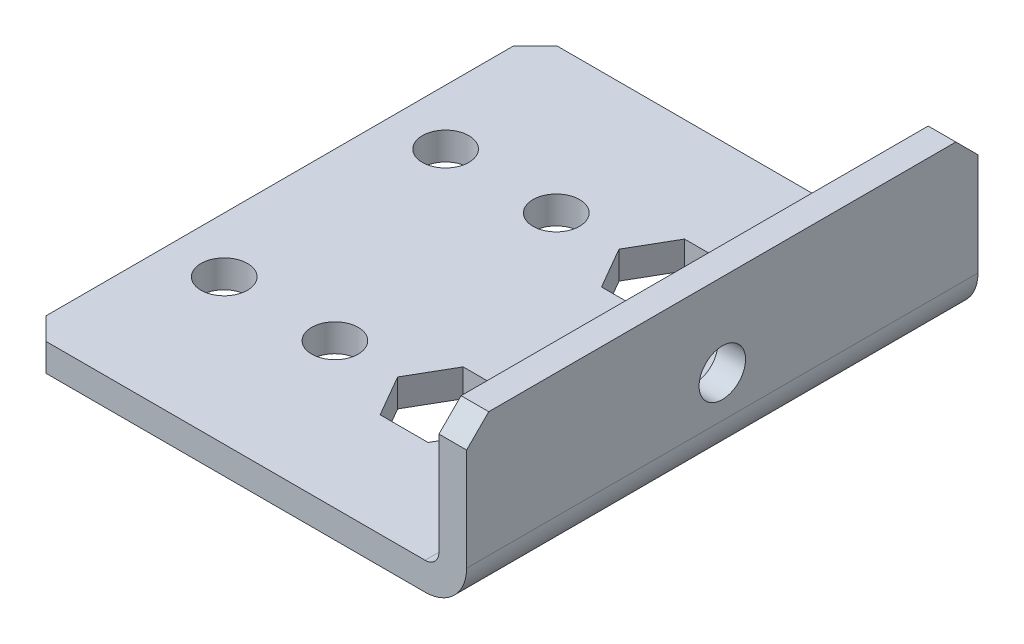
ISO-10303-21;
HEADER;
FILE_DESCRIPTION(('STEP AP214'),'2;1');
FILE_NAME('part.step','',(''),(''),'','','');
FILE_SCHEMA(('AUTOMOTIVE_DESIGN { 1 0 10303 214 1 1 1 1 }'));
ENDSEC;
DATA;
#1=APPLICATION_CONTEXT('core data for automotive mechanical design processes');
#2=APPLICATION_PROTOCOL_DEFINITION('international standard','automotive_design',2000,#1);
#3=PRODUCT_CONTEXT('',#1,'mechanical');
#4=PRODUCT('Part','Part','',(#3));
#5=PRODUCT_RELATED_PRODUCT_CATEGORY('part','',(#4));
#6=PRODUCT_DEFINITION_FORMATION('','',#4);
#7=PRODUCT_DEFINITION_CONTEXT('part definition',#1,'design');
#8=PRODUCT_DEFINITION('design','',#6,#7);
#9=PRODUCT_DEFINITION_SHAPE('','',#8);
#10=(LENGTH_UNIT() NAMED_UNIT(*) SI_UNIT(.MILLI.,.METRE.));
#11=(NAMED_UNIT(*) PLANE_ANGLE_UNIT() SI_UNIT($,.RADIAN.));
#12=(NAMED_UNIT(*) SI_UNIT($,.STERADIAN.) SOLID_ANGLE_UNIT());
#13=UNCERTAINTY_MEASURE_WITH_UNIT(LENGTH_MEASURE(1.E-05),#10,'distance_accuracy_value','');
#14=(GEOMETRIC_REPRESENTATION_CONTEXT(3) GLOBAL_UNCERTAINTY_ASSIGNED_CONTEXT((#13)) GLOBAL_UNIT_ASSIGNED_CONTEXT((#10,
#11,#12)) REPRESENTATION_CONTEXT('',''));
#15=CARTESIAN_POINT('',(0.,0.,0.));
#16=DIRECTION('',(0.,0.,1.));
#17=DIRECTION('',(1.,0.,0.));
#18=AXIS2_PLACEMENT_3D('',#15,#16,#17);
#19=CARTESIAN_POINT('',(19.0500000000001,9.525,12.7));
#20=DIRECTION('',(-1.,0.,0.));
#21=DIRECTION('',(0.,-1.,0.));
#22=AXIS2_PLACEMENT_3D('',#19,#20,#21);
#23=CYLINDRICAL_SURFACE('',#22,2.667);
#24=CARTESIAN_POINT('',(15.875,9.52500000000001,12.7));
#25=DIRECTION('',(-1.,0.,0.));
#26=DIRECTION('',(0.,-1.,0.));
#27=AXIS2_PLACEMENT_3D('',#24,#25,#26);
#28=CIRCLE('',#27,2.667);
#29=CARTESIAN_POINT('',(15.875,6.85800000000001,12.7));
#30=VERTEX_POINT('',#29);
#31=EDGE_CURVE('E225',#30,#30,#28,.F.);
#32=ORIENTED_EDGE('',*,*,#31,.F.);
#33=EDGE_LOOP('',(#32));
#34=FACE_BOUND('',#33,.T.);
#35=CARTESIAN_POINT('',(19.0500000000001,9.525,12.7));
#36=DIRECTION('',(-1.,0.,0.));
#37=DIRECTION('',(0.,-1.,0.));
#38=AXIS2_PLACEMENT_3D('',#35,#36,#37);
#39=CIRCLE('',#38,2.667);
#40=CARTESIAN_POINT('',(19.0500000000001,6.858,12.7));
#41=VERTEX_POINT('',#40);
#42=EDGE_CURVE('E20',#41,#41,#39,.F.);
#43=ORIENTED_EDGE('',*,*,#42,.T.);
#44=EDGE_LOOP('',(#43));
#45=FACE_BOUND('',#44,.T.);
#46=ADVANCED_FACE('F17',(#34,#45),#23,.F.);
#47=CARTESIAN_POINT('',(19.0500000000001,19.05,37.338));
#48=DIRECTION('',(0.,-1.,0.));
#49=DIRECTION('',(1.,0.,0.));
#50=AXIS2_PLACEMENT_3D('',#47,#48,#49);
#51=PLANE('',#50);
#52=DIRECTION('',(1.,0.,0.));
#53=VECTOR('',#52,1.);
#54=CARTESIAN_POINT('',(0.,19.05,39.497));
#55=LINE('',#54,#53);
#56=CARTESIAN_POINT('',(19.0500000000001,19.05,39.497));
#57=VERTEX_POINT('',#56);
#58=CARTESIAN_POINT('',(15.8750000000001,19.05,39.497));
#59=VERTEX_POINT('',#58);
#60=EDGE_CURVE('E167',#57,#59,#55,.F.);
#61=ORIENTED_EDGE('',*,*,#60,.F.);
#62=DIRECTION('',(0.,0.,1.));
#63=VECTOR('',#62,1.);
#64=CARTESIAN_POINT('',(19.0500000000001,19.05,0.));
#65=LINE('',#64,#63);
#66=CARTESIAN_POINT('',(19.0500000000001,19.05,-14.097));
#67=VERTEX_POINT('',#66);
#68=EDGE_CURVE('E165',#57,#67,#65,.F.);
#69=ORIENTED_EDGE('',*,*,#68,.T.);
#70=DIRECTION('',(1.,0.,0.));
#71=VECTOR('',#70,1.);
#72=CARTESIAN_POINT('',(19.0500000000001,19.05,-14.097));
#73=LINE('',#72,#71);
#74=CARTESIAN_POINT('',(15.8750000000001,19.05,-14.097));
#75=VERTEX_POINT('',#74);
#76=EDGE_CURVE('E151',#67,#75,#73,.F.);
#77=ORIENTED_EDGE('',*,*,#76,.T.);
#78=DIRECTION('',(0.,0.,1.));
#79=VECTOR('',#78,1.);
#80=CARTESIAN_POINT('',(15.8750000000001,19.05,0.));
#81=LINE('',#80,#79);
#82=EDGE_CURVE('E243',#59,#75,#81,.F.);
#83=ORIENTED_EDGE('',*,*,#82,.F.);
#84=EDGE_LOOP('',(#61,#69,#77,#83));
#85=FACE_BOUND('',#84,.T.);
#86=ADVANCED_FACE('F166',(#85),#51,.F.);
#87=CARTESIAN_POINT('',(19.0500000000001,19.05,-14.097));
#88=DIRECTION('',(0.,-0.707106781186548,0.707106781186548));
#89=DIRECTION('',(0.,-0.707106781186548,-0.707106781186548));
#90=AXIS2_PLACEMENT_3D('',#87,#88,#89);
#91=PLANE('',#90);
#92=DIRECTION('',(1.,0.,0.));
#93=VECTOR('',#92,1.);
#94=CARTESIAN_POINT('',(19.0500000000001,16.51,-16.637));
#95=LINE('',#94,#93);
#96=CARTESIAN_POINT('',(19.05,16.51,-16.637));
#97=VERTEX_POINT('',#96);
#98=CARTESIAN_POINT('',(15.8750000000001,16.51,-16.637));
#99=VERTEX_POINT('',#98);
#100=EDGE_CURVE('E162',#97,#99,#95,.F.);
#101=ORIENTED_EDGE('',*,*,#100,.T.);
#102=DIRECTION('',(0.,-0.707106781186545,-0.707106781186549));
#103=VECTOR('',#102,1.);
#104=CARTESIAN_POINT('',(15.8750000000001,19.05,-14.097));
#105=LINE('',#104,#103);
#106=EDGE_CURVE('E158',#75,#99,#105,.T.);
#107=ORIENTED_EDGE('',*,*,#106,.F.);
#108=ORIENTED_EDGE('',*,*,#76,.F.);
#109=DIRECTION('',(0.,-0.707106781186547,-0.707106781186547));
#110=VECTOR('',#109,1.);
#111=CARTESIAN_POINT('',(19.0500000000001,19.05,-14.097));
#112=LINE('',#111,#110);
#113=EDGE_CURVE('E155',#67,#97,#112,.T.);
#114=ORIENTED_EDGE('',*,*,#113,.T.);
#115=EDGE_LOOP('',(#101,#107,#108,#114));
#116=FACE_BOUND('',#115,.T.);
#117=ADVANCED_FACE('F153',(#116),#91,.F.);
#118=CARTESIAN_POINT('',(19.05,0.,0.));
#119=DIRECTION('',(-1.,0.,0.));
#120=DIRECTION('',(0.,-1.,0.));
#121=AXIS2_PLACEMENT_3D('',#118,#119,#120);
#122=PLANE('',#121);
#123=DIRECTION('',(0.,-0.707106781186546,0.707106781186549));
#124=VECTOR('',#123,1.);
#125=CARTESIAN_POINT('',(19.0500000000001,16.51,42.037));
#126=LINE('',#125,#124);
#127=CARTESIAN_POINT('',(19.05,16.51,42.037));
#128=VERTEX_POINT('',#127);
#129=EDGE_CURVE('E170',#128,#57,#126,.F.);
#130=ORIENTED_EDGE('',*,*,#129,.F.);
#131=DIRECTION('',(0.,1.,0.));
#132=VECTOR('',#131,1.);
#133=CARTESIAN_POINT('',(19.05,0.,42.037));
#134=LINE('',#133,#132);
#135=CARTESIAN_POINT('',(19.05,4.76249999999999,42.037));
#136=VERTEX_POINT('',#135);
#137=EDGE_CURVE('E248',#136,#128,#134,.T.);
#138=ORIENTED_EDGE('',*,*,#137,.F.);
#139=DIRECTION('',(0.,0.,-1.));
#140=VECTOR('',#139,1.);
#141=CARTESIAN_POINT('',(19.05,4.76249999999998,-16.637));
#142=LINE('',#141,#140);
#143=CARTESIAN_POINT('',(19.05,4.76249999999998,-16.637));
#144=VERTEX_POINT('',#143);
#145=EDGE_CURVE('E229',#144,#136,#142,.F.);
#146=ORIENTED_EDGE('',*,*,#145,.F.);
#147=DIRECTION('',(0.,-1.,0.));
#148=VECTOR('',#147,1.);
#149=CARTESIAN_POINT('',(19.05,0.,-16.637));
#150=LINE('',#149,#148);
#151=EDGE_CURVE('E171',#97,#144,#150,.T.);
#152=ORIENTED_EDGE('',*,*,#151,.F.);
#153=ORIENTED_EDGE('',*,*,#113,.F.);
#154=ORIENTED_EDGE('',*,*,#68,.F.);
#155=EDGE_LOOP('',(#130,#138,#146,#152,#153,#154));
#156=FACE_BOUND('',#155,.T.);
#157=ORIENTED_EDGE('',*,*,#42,.F.);
#158=EDGE_LOOP('',(#157));
#159=FACE_BOUND('',#158,.T.);
#160=ADVANCED_FACE('F174',(#156,#159),#122,.F.);
#161=CARTESIAN_POINT('',(0.,16.5100000000001,42.037));
#162=DIRECTION('',(0.,0.707106781186549,0.707106781186546));
#163=DIRECTION('',(0.,-0.707106781186546,0.707106781186549));
#164=AXIS2_PLACEMENT_3D('',#161,#162,#163);
#165=PLANE('',#164);
#166=DIRECTION('',(0.,0.707106781186546,-0.707106781186549));
#167=VECTOR('',#166,1.);
#168=CARTESIAN_POINT('',(15.8750000000001,16.51,42.037));
#169=LINE('',#168,#167);
#170=CARTESIAN_POINT('',(15.8750000000001,16.51,42.037));
#171=VERTEX_POINT('',#170);
#172=EDGE_CURVE('E227',#171,#59,#169,.T.);
#173=ORIENTED_EDGE('',*,*,#172,.F.);
#174=DIRECTION('',(1.,0.,0.));
#175=VECTOR('',#174,1.);
#176=CARTESIAN_POINT('',(0.,16.51,42.037));
#177=LINE('',#176,#175);
#178=EDGE_CURVE('E244',#128,#171,#177,.F.);
#179=ORIENTED_EDGE('',*,*,#178,.F.);
#180=ORIENTED_EDGE('',*,*,#129,.T.);
#181=ORIENTED_EDGE('',*,*,#60,.T.);
#182=EDGE_LOOP('',(#173,#179,#180,#181));
#183=FACE_BOUND('',#182,.T.);
#184=ADVANCED_FACE('F262',(#183),#165,.T.);
#185=CARTESIAN_POINT('',(0.,0.,0.));
#186=DIRECTION('',(0.,1.,0.));
#187=DIRECTION('',(0.,0.,1.));
#188=AXIS2_PLACEMENT_3D('',#185,#186,#187);
#189=PLANE('',#188);
#190=DIRECTION('',(0.707106781186548,0.,-0.707106781186548));
#191=VECTOR('',#190,1.);
#192=CARTESIAN_POINT('',(-29.21,0.,-16.637));
#193=LINE('',#192,#191);
#194=CARTESIAN_POINT('',(-31.75,0.,-14.097));
#195=VERTEX_POINT('',#194);
#196=CARTESIAN_POINT('',(-29.21,0.,-16.637));
#197=VERTEX_POINT('',#196);
#198=EDGE_CURVE('E253',#195,#197,#193,.T.);
#199=ORIENTED_EDGE('',*,*,#198,.T.);
#200=DIRECTION('',(-1.,0.,0.));
#201=VECTOR('',#200,1.);
#202=CARTESIAN_POINT('',(-31.75,0.,-16.637));
#203=LINE('',#202,#201);
#204=CARTESIAN_POINT('',(14.2875,0.,-16.637));
#205=VERTEX_POINT('',#204);
#206=EDGE_CURVE('E210',#205,#197,#203,.T.);
#207=ORIENTED_EDGE('',*,*,#206,.F.);
#208=DIRECTION('',(0.,0.,-1.));
#209=VECTOR('',#208,1.);
#210=CARTESIAN_POINT('',(14.2875,0.,-16.637));
#211=LINE('',#210,#209);
#212=CARTESIAN_POINT('',(14.2875,0.,42.037));
#213=VERTEX_POINT('',#212);
#214=EDGE_CURVE('E67',#213,#205,#211,.T.);
#215=ORIENTED_EDGE('',*,*,#214,.F.);
#216=DIRECTION('',(1.,0.,0.));
#217=VECTOR('',#216,1.);
#218=CARTESIAN_POINT('',(0.,0.,42.037));
#219=LINE('',#218,#217);
#220=CARTESIAN_POINT('',(-29.21,0.,42.037));
#221=VERTEX_POINT('',#220);
#222=EDGE_CURVE('E206',#221,#213,#219,.T.);
#223=ORIENTED_EDGE('',*,*,#222,.F.);
#224=DIRECTION('',(-0.707106781186547,0.,-0.707106781186549));
#225=VECTOR('',#224,1.);
#226=CARTESIAN_POINT('',(-29.21,0.,42.037));
#227=LINE('',#226,#225);
#228=CARTESIAN_POINT('',(-31.75,0.,39.497));
#229=VERTEX_POINT('',#228);
#230=EDGE_CURVE('E237',#221,#229,#227,.T.);
#231=ORIENTED_EDGE('',*,*,#230,.T.);
#232=DIRECTION('',(0.,0.,1.));
#233=VECTOR('',#232,1.);
#234=CARTESIAN_POINT('',(-31.75,0.,-16.637));
#235=LINE('',#234,#233);
#236=EDGE_CURVE('E240',#195,#229,#235,.T.);
#237=ORIENTED_EDGE('',*,*,#236,.F.);
#238=EDGE_LOOP('',(#199,#207,#215,#223,#231,#237));
#239=FACE_BOUND('',#238,.T.);
#240=CARTESIAN_POINT('',(-25.4,0.,0.));
#241=DIRECTION('',(0.,1.,0.));
#242=DIRECTION('',(0.,0.,1.));
#243=AXIS2_PLACEMENT_3D('',#240,#241,#242);
#244=CIRCLE('',#243,2.667);
#245=CARTESIAN_POINT('',(-25.4,0.,2.667));
#246=VERTEX_POINT('',#245);
#247=EDGE_CURVE('E207',#246,#246,#244,.T.);
#248=ORIENTED_EDGE('',*,*,#247,.T.);
#249=EDGE_LOOP('',(#248));
#250=FACE_BOUND('',#249,.T.);
#251=DIRECTION('',(-0.500000000000001,0.,-0.866025403784438));
#252=VECTOR('',#251,1.);
#253=CARTESIAN_POINT('',(5.49926131403118,0.,0.));
#254=LINE('',#253,#252);
#255=CARTESIAN_POINT('',(5.49926131403118,0.,0.));
#256=VERTEX_POINT('',#255);
#257=CARTESIAN_POINT('',(2.74963065701559,0.,-4.7625));
#258=VERTEX_POINT('',#257);
#259=EDGE_CURVE('E79',#256,#258,#254,.T.);
#260=ORIENTED_EDGE('',*,*,#259,.T.);
#261=DIRECTION('',(-1.,0.,0.));
#262=VECTOR('',#261,1.);
#263=CARTESIAN_POINT('',(2.74963065701559,0.,-4.7625));
#264=LINE('',#263,#262);
#265=CARTESIAN_POINT('',(-2.74963065701559,0.,-4.7625));
#266=VERTEX_POINT('',#265);
#267=EDGE_CURVE('E307',#258,#266,#264,.T.);
#268=ORIENTED_EDGE('',*,*,#267,.T.);
#269=DIRECTION('',(-0.5,0.,0.866025403784439));
#270=VECTOR('',#269,1.);
#271=CARTESIAN_POINT('',(-2.74963065701559,0.,-4.7625));
#272=LINE('',#271,#270);
#273=CARTESIAN_POINT('',(-5.49926131403118,0.,0.));
#274=VERTEX_POINT('',#273);
#275=EDGE_CURVE('E312',#266,#274,#272,.T.);
#276=ORIENTED_EDGE('',*,*,#275,.T.);
#277=DIRECTION('',(0.5,0.,0.866025403784438));
#278=VECTOR('',#277,1.);
#279=CARTESIAN_POINT('',(-5.49926131403119,0.,0.));
#280=LINE('',#279,#278);
#281=CARTESIAN_POINT('',(-2.74963065701559,0.,4.7625));
#282=VERTEX_POINT('',#281);
#283=EDGE_CURVE('E317',#274,#282,#280,.T.);
#284=ORIENTED_EDGE('',*,*,#283,.T.);
#285=DIRECTION('',(1.,0.,0.));
#286=VECTOR('',#285,1.);
#287=CARTESIAN_POINT('',(-2.74963065701559,0.,4.7625));
#288=LINE('',#287,#286);
#289=CARTESIAN_POINT('',(2.74963065701559,0.,4.7625));
#290=VERTEX_POINT('',#289);
#291=EDGE_CURVE('E319',#282,#290,#288,.T.);
#292=ORIENTED_EDGE('',*,*,#291,.T.);
#293=DIRECTION('',(0.5,0.,-0.866025403784439));
#294=VECTOR('',#293,1.);
#295=CARTESIAN_POINT('',(2.74963065701559,0.,4.7625));
#296=LINE('',#295,#294);
#297=EDGE_CURVE('E215',#290,#256,#296,.T.);
#298=ORIENTED_EDGE('',*,*,#297,.T.);
#299=EDGE_LOOP('',(#260,#268,#276,#284,#292,#298));
#300=FACE_BOUND('',#299,.T.);
#301=CARTESIAN_POINT('',(-12.7,0.,0.));
#302=DIRECTION('',(0.,1.,0.));
#303=DIRECTION('',(0.,0.,1.));
#304=AXIS2_PLACEMENT_3D('',#301,#302,#303);
#305=CIRCLE('',#304,2.667);
#306=CARTESIAN_POINT('',(-12.7,0.,2.667));
#307=VERTEX_POINT('',#306);
#308=EDGE_CURVE('E212',#307,#307,#305,.T.);
#309=ORIENTED_EDGE('',*,*,#308,.T.);
#310=EDGE_LOOP('',(#309));
#311=FACE_BOUND('',#310,.T.);
#312=CARTESIAN_POINT('',(-12.7,0.,25.4));
#313=DIRECTION('',(0.,1.,0.));
#314=DIRECTION('',(0.,0.,1.));
#315=AXIS2_PLACEMENT_3D('',#312,#313,#314);
#316=CIRCLE('',#315,2.667);
#317=CARTESIAN_POINT('',(-12.7,0.,28.067));
#318=VERTEX_POINT('',#317);
#319=EDGE_CURVE('E216',#318,#318,#316,.T.);
#320=ORIENTED_EDGE('',*,*,#319,.T.);
#321=EDGE_LOOP('',(#320));
#322=FACE_BOUND('',#321,.T.);
#323=DIRECTION('',(1.,0.,0.));
#324=VECTOR('',#323,1.);
#325=CARTESIAN_POINT('',(-2.74963065701559,0.,30.1625));
#326=LINE('',#325,#324);
#327=CARTESIAN_POINT('',(-2.74963065701559,0.,30.1625));
#328=VERTEX_POINT('',#327);
#329=CARTESIAN_POINT('',(2.74963065701559,0.,30.1625));
#330=VERTEX_POINT('',#329);
#331=EDGE_CURVE('E328',#328,#330,#326,.T.);
#332=ORIENTED_EDGE('',*,*,#331,.T.);
#333=DIRECTION('',(0.5,0.,-0.866025403784439));
#334=VECTOR('',#333,1.);
#335=CARTESIAN_POINT('',(2.74963065701559,0.,30.1625));
#336=LINE('',#335,#334);
#337=CARTESIAN_POINT('',(5.49926131403118,0.,25.4));
#338=VERTEX_POINT('',#337);
#339=EDGE_CURVE('E336',#330,#338,#336,.T.);
#340=ORIENTED_EDGE('',*,*,#339,.T.);
#341=DIRECTION('',(-0.5,0.,-0.866025403784439));
#342=VECTOR('',#341,1.);
#343=CARTESIAN_POINT('',(5.49926131403118,0.,25.4));
#344=LINE('',#343,#342);
#345=CARTESIAN_POINT('',(2.74963065701559,0.,20.6375));
#346=VERTEX_POINT('',#345);
#347=EDGE_CURVE('E341',#338,#346,#344,.T.);
#348=ORIENTED_EDGE('',*,*,#347,.T.);
#349=DIRECTION('',(-1.,0.,0.));
#350=VECTOR('',#349,1.);
#351=CARTESIAN_POINT('',(2.74963065701559,0.,20.6375));
#352=LINE('',#351,#350);
#353=CARTESIAN_POINT('',(-2.74963065701559,0.,20.6375));
#354=VERTEX_POINT('',#353);
#355=EDGE_CURVE('E346',#346,#354,#352,.T.);
#356=ORIENTED_EDGE('',*,*,#355,.T.);
#357=DIRECTION('',(-0.5,0.,0.866025403784439));
#358=VECTOR('',#357,1.);
#359=CARTESIAN_POINT('',(-2.74963065701559,0.,20.6375));
#360=LINE('',#359,#358);
#361=CARTESIAN_POINT('',(-5.49926131403118,0.,25.4));
#362=VERTEX_POINT('',#361);
#363=EDGE_CURVE('E348',#354,#362,#360,.T.);
#364=ORIENTED_EDGE('',*,*,#363,.T.);
#365=DIRECTION('',(0.5,0.,0.866025403784439));
#366=VECTOR('',#365,1.);
#367=CARTESIAN_POINT('',(-5.49926131403118,0.,25.4));
#368=LINE('',#367,#366);
#369=EDGE_CURVE('E223',#362,#328,#368,.T.);
#370=ORIENTED_EDGE('',*,*,#369,.T.);
#371=EDGE_LOOP('',(#332,#340,#348,#356,#364,#370));
#372=FACE_BOUND('',#371,.T.);
#373=CARTESIAN_POINT('',(-25.4,0.,25.4));
#374=DIRECTION('',(0.,1.,0.));
#375=DIRECTION('',(0.,0.,1.));
#376=AXIS2_PLACEMENT_3D('',#373,#374,#375);
#377=CIRCLE('',#376,2.667);
#378=CARTESIAN_POINT('',(-25.4,0.,28.067));
#379=VERTEX_POINT('',#378);
#380=EDGE_CURVE('E220',#379,#379,#377,.T.);
#381=ORIENTED_EDGE('',*,*,#380,.T.);
#382=EDGE_LOOP('',(#381));
#383=FACE_BOUND('',#382,.T.);
#384=ADVANCED_FACE('F355',(#239,#250,#300,#311,#322,#372,#383),#189,.F.);
#385=CARTESIAN_POINT('',(14.2875,4.7625,-16.637));
#386=DIRECTION('',(0.,0.,-1.));
#387=DIRECTION('',(-1.,0.,0.));
#388=AXIS2_PLACEMENT_3D('',#385,#386,#387);
#389=CYLINDRICAL_SURFACE('',#388,4.7625);
#390=ORIENTED_EDGE('',*,*,#145,.T.);
#391=CARTESIAN_POINT('',(14.2875,4.7625,42.037));
#392=DIRECTION('',(0.,0.,-1.));
#393=DIRECTION('',(-1.,0.,0.));
#394=AXIS2_PLACEMENT_3D('',#391,#392,#393);
#395=CIRCLE('',#394,4.7625);
#396=EDGE_CURVE('E203',#213,#136,#395,.F.);
#397=ORIENTED_EDGE('',*,*,#396,.F.);
#398=ORIENTED_EDGE('',*,*,#214,.T.);
#399=CARTESIAN_POINT('',(14.2875,4.7625,-16.637));
#400=DIRECTION('',(0.,0.,-1.));
#401=DIRECTION('',(-1.,0.,0.));
#402=AXIS2_PLACEMENT_3D('',#399,#400,#401);
#403=CIRCLE('',#402,4.7625);
#404=EDGE_CURVE('E228',#205,#144,#403,.F.);
#405=ORIENTED_EDGE('',*,*,#404,.T.);
#406=EDGE_LOOP('',(#390,#397,#398,#405));
#407=FACE_BOUND('',#406,.T.);
#408=ADVANCED_FACE('F411',(#407),#389,.T.);
#409=CARTESIAN_POINT('',(15.875,0.,0.));
#410=DIRECTION('',(-1.,0.,0.));
#411=DIRECTION('',(0.,-1.,0.));
#412=AXIS2_PLACEMENT_3D('',#409,#410,#411);
#413=PLANE('',#412);
#414=DIRECTION('',(0.,-1.,0.));
#415=VECTOR('',#414,1.);
#416=CARTESIAN_POINT('',(15.875,0.,-16.637));
#417=LINE('',#416,#415);
#418=CARTESIAN_POINT('',(15.875,4.76249999999999,-16.637));
#419=VERTEX_POINT('',#418);
#420=EDGE_CURVE('E224',#99,#419,#417,.T.);
#421=ORIENTED_EDGE('',*,*,#420,.T.);
#422=DIRECTION('',(0.,0.,-1.));
#423=VECTOR('',#422,1.);
#424=CARTESIAN_POINT('',(15.875,4.7625,-16.637));
#425=LINE('',#424,#423);
#426=CARTESIAN_POINT('',(15.875,4.7625,42.037));
#427=VERTEX_POINT('',#426);
#428=EDGE_CURVE('E200',#419,#427,#425,.F.);
#429=ORIENTED_EDGE('',*,*,#428,.T.);
#430=DIRECTION('',(0.,1.,0.));
#431=VECTOR('',#430,1.);
#432=CARTESIAN_POINT('',(15.8750000000001,0.,42.037));
#433=LINE('',#432,#431);
#434=EDGE_CURVE('E247',#171,#427,#433,.F.);
#435=ORIENTED_EDGE('',*,*,#434,.F.);
#436=ORIENTED_EDGE('',*,*,#172,.T.);
#437=ORIENTED_EDGE('',*,*,#82,.T.);
#438=ORIENTED_EDGE('',*,*,#106,.T.);
#439=EDGE_LOOP('',(#421,#429,#435,#436,#437,#438));
#440=FACE_BOUND('',#439,.T.);
#441=ORIENTED_EDGE('',*,*,#31,.T.);
#442=EDGE_LOOP('',(#441));
#443=FACE_BOUND('',#442,.T.);
#444=ADVANCED_FACE('F267',(#440,#443),#413,.T.);
#445=CARTESIAN_POINT('',(-25.4,3.175,25.4));
#446=DIRECTION('',(0.,1.,0.));
#447=DIRECTION('',(0.,0.,1.));
#448=AXIS2_PLACEMENT_3D('',#445,#446,#447);
#449=CYLINDRICAL_SURFACE('',#448,2.667);
#450=CARTESIAN_POINT('',(-25.4,3.175,25.4));
#451=DIRECTION('',(0.,1.,0.));
#452=DIRECTION('',(0.,0.,1.));
#453=AXIS2_PLACEMENT_3D('',#450,#451,#452);
#454=CIRCLE('',#453,2.667);
#455=CARTESIAN_POINT('',(-25.4,3.175,28.067));
#456=VERTEX_POINT('',#455);
#457=EDGE_CURVE('E195',#456,#456,#454,.F.);
#458=ORIENTED_EDGE('',*,*,#457,.F.);
#459=EDGE_LOOP('',(#458));
#460=FACE_BOUND('',#459,.T.);
#461=ORIENTED_EDGE('',*,*,#380,.F.);
#462=EDGE_LOOP('',(#461));
#463=FACE_BOUND('',#462,.T.);
#464=ADVANCED_FACE('F419',(#460,#463),#449,.F.);
#465=CARTESIAN_POINT('',(-5.49926131403118,3.175,25.4));
#466=DIRECTION('',(-0.866025403784439,0.,0.5));
#467=DIRECTION('',(0.5,0.,0.866025403784439));
#468=AXIS2_PLACEMENT_3D('',#465,#466,#467);
#469=PLANE('',#468);
#470=ORIENTED_EDGE('',*,*,#369,.F.);
#471=DIRECTION('',(0.,1.,0.));
#472=VECTOR('',#471,1.);
#473=CARTESIAN_POINT('',(-5.49926131403118,3.175,25.4));
#474=LINE('',#473,#472);
#475=CARTESIAN_POINT('',(-5.49926131403118,3.175,25.4));
#476=VERTEX_POINT('',#475);
#477=EDGE_CURVE('E351',#362,#476,#474,.T.);
#478=ORIENTED_EDGE('',*,*,#477,.T.);
#479=DIRECTION('',(-0.5,0.,-0.866025403784439));
#480=VECTOR('',#479,1.);
#481=CARTESIAN_POINT('',(-2.74963065701559,3.175,30.1625));
#482=LINE('',#481,#480);
#483=CARTESIAN_POINT('',(-2.74963065701559,3.175,30.1625));
#484=VERTEX_POINT('',#483);
#485=EDGE_CURVE('E198',#484,#476,#482,.T.);
#486=ORIENTED_EDGE('',*,*,#485,.F.);
#487=DIRECTION('',(0.,1.,0.));
#488=VECTOR('',#487,1.);
#489=CARTESIAN_POINT('',(-2.74963065701559,3.175,30.1625));
#490=LINE('',#489,#488);
#491=EDGE_CURVE('E330',#484,#328,#490,.F.);
#492=ORIENTED_EDGE('',*,*,#491,.T.);
#493=EDGE_LOOP('',(#470,#478,#486,#492));
#494=FACE_BOUND('',#493,.T.);
#495=ADVANCED_FACE('F364',(#494),#469,.F.);
#496=CARTESIAN_POINT('',(-2.74963065701559,3.175,20.6375));
#497=DIRECTION('',(-0.866025403784439,0.,-0.5));
#498=DIRECTION('',(-0.5,0.,0.866025403784439));
#499=AXIS2_PLACEMENT_3D('',#496,#497,#498);
#500=PLANE('',#499);
#501=DIRECTION('',(0.,1.,0.));
#502=VECTOR('',#501,1.);
#503=CARTESIAN_POINT('',(-2.74963065701559,3.175,20.6375));
#504=LINE('',#503,#502);
#505=CARTESIAN_POINT('',(-2.74963065701559,3.175,20.6375));
#506=VERTEX_POINT('',#505);
#507=EDGE_CURVE('E343',#354,#506,#504,.T.);
#508=ORIENTED_EDGE('',*,*,#507,.T.);
#509=DIRECTION('',(0.5,0.,-0.866025403784439));
#510=VECTOR('',#509,1.);
#511=CARTESIAN_POINT('',(-5.49926131403118,3.175,25.4));
#512=LINE('',#511,#510);
#513=EDGE_CURVE('E395',#476,#506,#512,.T.);
#514=ORIENTED_EDGE('',*,*,#513,.F.);
#515=ORIENTED_EDGE('',*,*,#477,.F.);
#516=ORIENTED_EDGE('',*,*,#363,.F.);
#517=EDGE_LOOP('',(#508,#514,#515,#516));
#518=FACE_BOUND('',#517,.T.);
#519=ADVANCED_FACE('F396',(#518),#500,.F.);
#520=CARTESIAN_POINT('',(2.74963065701559,3.175,20.6375));
#521=DIRECTION('',(0.,0.,-1.));
#522=DIRECTION('',(-1.,0.,0.));
#523=AXIS2_PLACEMENT_3D('',#520,#521,#522);
#524=PLANE('',#523);
#525=ORIENTED_EDGE('',*,*,#355,.F.);
#526=DIRECTION('',(0.,1.,0.));
#527=VECTOR('',#526,1.);
#528=CARTESIAN_POINT('',(2.74963065701559,3.175,20.6375));
#529=LINE('',#528,#527);
#530=CARTESIAN_POINT('',(2.74963065701559,3.175,20.6375));
#531=VERTEX_POINT('',#530);
#532=EDGE_CURVE('E338',#346,#531,#529,.T.);
#533=ORIENTED_EDGE('',*,*,#532,.T.);
#534=DIRECTION('',(1.,0.,0.));
#535=VECTOR('',#534,1.);
#536=CARTESIAN_POINT('',(0.,3.175,20.6375));
#537=LINE('',#536,#535);
#538=EDGE_CURVE('E401',#506,#531,#537,.T.);
#539=ORIENTED_EDGE('',*,*,#538,.F.);
#540=ORIENTED_EDGE('',*,*,#507,.F.);
#541=EDGE_LOOP('',(#525,#533,#539,#540));
#542=FACE_BOUND('',#541,.T.);
#543=ADVANCED_FACE('F494',(#542),#524,.F.);
#544=CARTESIAN_POINT('',(5.49926131403118,3.175,25.4));
#545=DIRECTION('',(0.866025403784439,0.,-0.5));
#546=DIRECTION('',(-0.5,0.,-0.866025403784439));
#547=AXIS2_PLACEMENT_3D('',#544,#545,#546);
#548=PLANE('',#547);
#549=ORIENTED_EDGE('',*,*,#347,.F.);
#550=DIRECTION('',(0.,1.,0.));
#551=VECTOR('',#550,1.);
#552=CARTESIAN_POINT('',(5.49926131403118,3.175,25.4));
#553=LINE('',#552,#551);
#554=CARTESIAN_POINT('',(5.49926131403118,3.175,25.4));
#555=VERTEX_POINT('',#554);
#556=EDGE_CURVE('E333',#338,#555,#553,.T.);
#557=ORIENTED_EDGE('',*,*,#556,.T.);
#558=DIRECTION('',(0.5,0.,0.866025403784439));
#559=VECTOR('',#558,1.);
#560=CARTESIAN_POINT('',(2.74963065701559,3.175,20.6375));
#561=LINE('',#560,#559);
#562=EDGE_CURVE('E716',#531,#555,#561,.T.);
#563=ORIENTED_EDGE('',*,*,#562,.F.);
#564=ORIENTED_EDGE('',*,*,#532,.F.);
#565=EDGE_LOOP('',(#549,#557,#563,#564));
#566=FACE_BOUND('',#565,.T.);
#567=ADVANCED_FACE('F491',(#566),#548,.F.);
#568=CARTESIAN_POINT('',(2.74963065701559,3.175,30.1625));
#569=DIRECTION('',(0.866025403784439,0.,0.5));
#570=DIRECTION('',(0.5,0.,-0.866025403784439));
#571=AXIS2_PLACEMENT_3D('',#568,#569,#570);
#572=PLANE('',#571);
#573=ORIENTED_EDGE('',*,*,#339,.F.);
#574=DIRECTION('',(0.,1.,0.));
#575=VECTOR('',#574,1.);
#576=CARTESIAN_POINT('',(2.74963065701559,3.175,30.1625));
#577=LINE('',#576,#575);
#578=CARTESIAN_POINT('',(2.74963065701559,3.175,30.1625));
#579=VERTEX_POINT('',#578);
#580=EDGE_CURVE('E219',#330,#579,#577,.T.);
#581=ORIENTED_EDGE('',*,*,#580,.T.);
#582=DIRECTION('',(-0.5,0.,0.866025403784439));
#583=VECTOR('',#582,1.);
#584=CARTESIAN_POINT('',(5.49926131403118,3.175,25.4));
#585=LINE('',#584,#583);
#586=EDGE_CURVE('E379',#555,#579,#585,.T.);
#587=ORIENTED_EDGE('',*,*,#586,.F.);
#588=ORIENTED_EDGE('',*,*,#556,.F.);
#589=EDGE_LOOP('',(#573,#581,#587,#588));
#590=FACE_BOUND('',#589,.T.);
#591=ADVANCED_FACE('F376',(#590),#572,.F.);
#592=CARTESIAN_POINT('',(-2.74963065701559,3.175,30.1625));
#593=DIRECTION('',(0.,0.,1.));
#594=DIRECTION('',(1.,0.,0.));
#595=AXIS2_PLACEMENT_3D('',#592,#593,#594);
#596=PLANE('',#595);
#597=ORIENTED_EDGE('',*,*,#331,.F.);
#598=ORIENTED_EDGE('',*,*,#491,.F.);
#599=DIRECTION('',(1.,0.,0.));
#600=VECTOR('',#599,1.);
#601=CARTESIAN_POINT('',(0.,3.175,30.1625));
#602=LINE('',#601,#600);
#603=EDGE_CURVE('E194',#579,#484,#602,.F.);
#604=ORIENTED_EDGE('',*,*,#603,.F.);
#605=ORIENTED_EDGE('',*,*,#580,.F.);
#606=EDGE_LOOP('',(#597,#598,#604,#605));
#607=FACE_BOUND('',#606,.T.);
#608=ADVANCED_FACE('F371',(#607),#596,.F.);
#609=CARTESIAN_POINT('',(-12.7,3.175,25.4));
#610=DIRECTION('',(0.,1.,0.));
#611=DIRECTION('',(0.,0.,1.));
#612=AXIS2_PLACEMENT_3D('',#609,#610,#611);
#613=CYLINDRICAL_SURFACE('',#612,2.667);
#614=CARTESIAN_POINT('',(-12.7,3.175,25.4));
#615=DIRECTION('',(0.,1.,0.));
#616=DIRECTION('',(0.,0.,1.));
#617=AXIS2_PLACEMENT_3D('',#614,#615,#616);
#618=CIRCLE('',#617,2.667);
#619=CARTESIAN_POINT('',(-12.7,3.175,28.067));
#620=VERTEX_POINT('',#619);
#621=EDGE_CURVE('E191',#620,#620,#618,.F.);
#622=ORIENTED_EDGE('',*,*,#621,.F.);
#623=EDGE_LOOP('',(#622));
#624=FACE_BOUND('',#623,.T.);
#625=ORIENTED_EDGE('',*,*,#319,.F.);
#626=EDGE_LOOP('',(#625));
#627=FACE_BOUND('',#626,.T.);
#628=ADVANCED_FACE('F482',(#624,#627),#613,.F.);
#629=CARTESIAN_POINT('',(-12.7,3.175,0.));
#630=DIRECTION('',(0.,1.,0.));
#631=DIRECTION('',(0.,0.,1.));
#632=AXIS2_PLACEMENT_3D('',#629,#630,#631);
#633=CYLINDRICAL_SURFACE('',#632,2.667);
#634=CARTESIAN_POINT('',(-12.7,3.175,0.));
#635=DIRECTION('',(0.,1.,0.));
#636=DIRECTION('',(0.,0.,1.));
#637=AXIS2_PLACEMENT_3D('',#634,#635,#636);
#638=CIRCLE('',#637,2.667);
#639=CARTESIAN_POINT('',(-12.7,3.175,2.667));
#640=VERTEX_POINT('',#639);
#641=EDGE_CURVE('E187',#640,#640,#638,.F.);
#642=ORIENTED_EDGE('',*,*,#641,.F.);
#643=EDGE_LOOP('',(#642));
#644=FACE_BOUND('',#643,.T.);
#645=ORIENTED_EDGE('',*,*,#308,.F.);
#646=EDGE_LOOP('',(#645));
#647=FACE_BOUND('',#646,.T.);
#648=ADVANCED_FACE('F478',(#644,#647),#633,.F.);
#649=CARTESIAN_POINT('',(2.74963065701559,3.175,4.7625));
#650=DIRECTION('',(0.866025403784439,0.,0.5));
#651=DIRECTION('',(0.5,0.,-0.866025403784439));
#652=AXIS2_PLACEMENT_3D('',#649,#650,#651);
#653=PLANE('',#652);
#654=ORIENTED_EDGE('',*,*,#297,.F.);
#655=DIRECTION('',(0.,1.,0.));
#656=VECTOR('',#655,1.);
#657=CARTESIAN_POINT('',(2.74963065701559,3.175,4.7625));
#658=LINE('',#657,#656);
#659=CARTESIAN_POINT('',(2.74963065701559,3.175,4.7625));
#660=VERTEX_POINT('',#659);
#661=EDGE_CURVE('E322',#290,#660,#658,.T.);
#662=ORIENTED_EDGE('',*,*,#661,.T.);
#663=DIRECTION('',(-0.5,0.,0.866025403784439));
#664=VECTOR('',#663,1.);
#665=CARTESIAN_POINT('',(5.49926131403118,3.175,0.));
#666=LINE('',#665,#664);
#667=CARTESIAN_POINT('',(5.49926131403118,3.175,0.));
#668=VERTEX_POINT('',#667);
#669=EDGE_CURVE('E190',#668,#660,#666,.T.);
#670=ORIENTED_EDGE('',*,*,#669,.F.);
#671=DIRECTION('',(0.,1.,0.));
#672=VECTOR('',#671,1.);
#673=CARTESIAN_POINT('',(5.49926131403118,3.175,0.));
#674=LINE('',#673,#672);
#675=EDGE_CURVE('E301',#668,#256,#674,.F.);
#676=ORIENTED_EDGE('',*,*,#675,.T.);
#677=EDGE_LOOP('',(#654,#662,#670,#676));
#678=FACE_BOUND('',#677,.T.);
#679=ADVANCED_FACE('F474',(#678),#653,.F.);
#680=CARTESIAN_POINT('',(-2.74963065701559,3.175,4.7625));
#681=DIRECTION('',(0.,0.,1.));
#682=DIRECTION('',(1.,0.,0.));
#683=AXIS2_PLACEMENT_3D('',#680,#681,#682);
#684=PLANE('',#683);
#685=DIRECTION('',(0.,1.,0.));
#686=VECTOR('',#685,1.);
#687=CARTESIAN_POINT('',(-2.74963065701559,3.175,4.7625));
#688=LINE('',#687,#686);
#689=CARTESIAN_POINT('',(-2.74963065701559,3.175,4.7625));
#690=VERTEX_POINT('',#689);
#691=EDGE_CURVE('E314',#282,#690,#688,.T.);
#692=ORIENTED_EDGE('',*,*,#691,.T.);
#693=DIRECTION('',(1.,0.,0.));
#694=VECTOR('',#693,1.);
#695=CARTESIAN_POINT('',(0.,3.175,4.7625));
#696=LINE('',#695,#694);
#697=EDGE_CURVE('E723',#660,#690,#696,.F.);
#698=ORIENTED_EDGE('',*,*,#697,.F.);
#699=ORIENTED_EDGE('',*,*,#661,.F.);
#700=ORIENTED_EDGE('',*,*,#291,.F.);
#701=EDGE_LOOP('',(#692,#698,#699,#700));
#702=FACE_BOUND('',#701,.T.);
#703=ADVANCED_FACE('F470',(#702),#684,.F.);
#704=CARTESIAN_POINT('',(-5.49926131403119,3.175,0.));
#705=DIRECTION('',(-0.866025403784438,0.,0.5));
#706=DIRECTION('',(0.5,0.,0.866025403784438));
#707=AXIS2_PLACEMENT_3D('',#704,#705,#706);
#708=PLANE('',#707);
#709=ORIENTED_EDGE('',*,*,#283,.F.);
#710=DIRECTION('',(0.,1.,0.));
#711=VECTOR('',#710,1.);
#712=CARTESIAN_POINT('',(-5.49926131403119,3.175,0.));
#713=LINE('',#712,#711);
#714=CARTESIAN_POINT('',(-5.49926131403118,3.175,0.));
#715=VERTEX_POINT('',#714);
#716=EDGE_CURVE('E309',#274,#715,#713,.T.);
#717=ORIENTED_EDGE('',*,*,#716,.T.);
#718=DIRECTION('',(-0.5,0.,-0.866025403784439));
#719=VECTOR('',#718,1.);
#720=CARTESIAN_POINT('',(-2.74963065701559,3.175,4.7625));
#721=LINE('',#720,#719);
#722=EDGE_CURVE('E726',#690,#715,#721,.T.);
#723=ORIENTED_EDGE('',*,*,#722,.F.);
#724=ORIENTED_EDGE('',*,*,#691,.F.);
#725=EDGE_LOOP('',(#709,#717,#723,#724));
#726=FACE_BOUND('',#725,.T.);
#727=ADVANCED_FACE('F466',(#726),#708,.F.);
#728=CARTESIAN_POINT('',(-2.74963065701559,3.175,-4.7625));
#729=DIRECTION('',(-0.866025403784439,0.,-0.5));
#730=DIRECTION('',(-0.5,0.,0.866025403784439));
#731=AXIS2_PLACEMENT_3D('',#728,#729,#730);
#732=PLANE('',#731);
#733=ORIENTED_EDGE('',*,*,#275,.F.);
#734=DIRECTION('',(0.,1.,0.));
#735=VECTOR('',#734,1.);
#736=CARTESIAN_POINT('',(-2.74963065701559,3.175,-4.7625));
#737=LINE('',#736,#735);
#738=CARTESIAN_POINT('',(-2.74963065701559,3.175,-4.7625));
#739=VERTEX_POINT('',#738);
#740=EDGE_CURVE('E304',#266,#739,#737,.T.);
#741=ORIENTED_EDGE('',*,*,#740,.T.);
#742=DIRECTION('',(0.5,0.,-0.866025403784439));
#743=VECTOR('',#742,1.);
#744=CARTESIAN_POINT('',(-5.49926131403119,3.175,0.));
#745=LINE('',#744,#743);
#746=EDGE_CURVE('E729',#715,#739,#745,.T.);
#747=ORIENTED_EDGE('',*,*,#746,.F.);
#748=ORIENTED_EDGE('',*,*,#716,.F.);
#749=EDGE_LOOP('',(#733,#741,#747,#748));
#750=FACE_BOUND('',#749,.T.);
#751=ADVANCED_FACE('F462',(#750),#732,.F.);
#752=CARTESIAN_POINT('',(2.74963065701559,3.175,-4.7625));
#753=DIRECTION('',(0.,0.,-1.));
#754=DIRECTION('',(-1.,0.,0.));
#755=AXIS2_PLACEMENT_3D('',#752,#753,#754);
#756=PLANE('',#755);
#757=ORIENTED_EDGE('',*,*,#267,.F.);
#758=DIRECTION('',(0.,1.,0.));
#759=VECTOR('',#758,1.);
#760=CARTESIAN_POINT('',(2.74963065701559,3.175,-4.7625));
#761=LINE('',#760,#759);
#762=CARTESIAN_POINT('',(2.74963065701559,3.175,-4.7625));
#763=VERTEX_POINT('',#762);
#764=EDGE_CURVE('E211',#258,#763,#761,.T.);
#765=ORIENTED_EDGE('',*,*,#764,.T.);
#766=DIRECTION('',(1.,0.,0.));
#767=VECTOR('',#766,1.);
#768=CARTESIAN_POINT('',(0.,3.175,-4.7625));
#769=LINE('',#768,#767);
#770=EDGE_CURVE('E732',#739,#763,#769,.T.);
#771=ORIENTED_EDGE('',*,*,#770,.F.);
#772=ORIENTED_EDGE('',*,*,#740,.F.);
#773=EDGE_LOOP('',(#757,#765,#771,#772));
#774=FACE_BOUND('',#773,.T.);
#775=ADVANCED_FACE('F458',(#774),#756,.F.);
#776=CARTESIAN_POINT('',(5.49926131403118,3.175,0.));
#777=DIRECTION('',(0.866025403784438,0.,-0.500000000000001));
#778=DIRECTION('',(-0.500000000000001,0.,-0.866025403784438));
#779=AXIS2_PLACEMENT_3D('',#776,#777,#778);
#780=PLANE('',#779);
#781=ORIENTED_EDGE('',*,*,#259,.F.);
#782=ORIENTED_EDGE('',*,*,#675,.F.);
#783=DIRECTION('',(0.5,0.,0.866025403784438));
#784=VECTOR('',#783,1.);
#785=CARTESIAN_POINT('',(2.74963065701559,3.175,-4.7625));
#786=LINE('',#785,#784);
#787=EDGE_CURVE('E186',#763,#668,#786,.T.);
#788=ORIENTED_EDGE('',*,*,#787,.F.);
#789=ORIENTED_EDGE('',*,*,#764,.F.);
#790=EDGE_LOOP('',(#781,#782,#788,#789));
#791=FACE_BOUND('',#790,.T.);
#792=ADVANCED_FACE('F454',(#791),#780,.F.);
#793=CARTESIAN_POINT('',(-25.4,3.175,0.));
#794=DIRECTION('',(0.,1.,0.));
#795=DIRECTION('',(0.,0.,1.));
#796=AXIS2_PLACEMENT_3D('',#793,#794,#795);
#797=CYLINDRICAL_SURFACE('',#796,2.667);
#798=CARTESIAN_POINT('',(-25.4,3.175,0.));
#799=DIRECTION('',(0.,1.,0.));
#800=DIRECTION('',(0.,0.,1.));
#801=AXIS2_PLACEMENT_3D('',#798,#799,#800);
#802=CIRCLE('',#801,2.667);
#803=CARTESIAN_POINT('',(-25.4,3.175,2.667));
#804=VERTEX_POINT('',#803);
#805=EDGE_CURVE('E182',#804,#804,#802,.F.);
#806=ORIENTED_EDGE('',*,*,#805,.F.);
#807=EDGE_LOOP('',(#806));
#808=FACE_BOUND('',#807,.T.);
#809=ORIENTED_EDGE('',*,*,#247,.F.);
#810=EDGE_LOOP('',(#809));
#811=FACE_BOUND('',#810,.T.);
#812=ADVANCED_FACE('F450',(#808,#811),#797,.F.);
#813=CARTESIAN_POINT('',(-31.75,3.175,-16.637));
#814=DIRECTION('',(0.,0.,-1.));
#815=DIRECTION('',(-1.,0.,0.));
#816=AXIS2_PLACEMENT_3D('',#813,#814,#815);
#817=PLANE('',#816);
#818=DIRECTION('',(1.,0.,0.));
#819=VECTOR('',#818,1.);
#820=CARTESIAN_POINT('',(0.,3.175,-16.637));
#821=LINE('',#820,#819);
#822=CARTESIAN_POINT('',(14.2875,3.175,-16.637));
#823=VERTEX_POINT('',#822);
#824=CARTESIAN_POINT('',(-29.21,3.175,-16.637));
#825=VERTEX_POINT('',#824);
#826=EDGE_CURVE('E185',#823,#825,#821,.F.);
#827=ORIENTED_EDGE('',*,*,#826,.F.);
#828=CARTESIAN_POINT('',(14.2875,4.7625,-16.637));
#829=DIRECTION('',(0.,0.,-1.));
#830=DIRECTION('',(-1.,0.,0.));
#831=AXIS2_PLACEMENT_3D('',#828,#829,#830);
#832=CIRCLE('',#831,1.5875);
#833=EDGE_CURVE('E201',#823,#419,#832,.F.);
#834=ORIENTED_EDGE('',*,*,#833,.T.);
#835=ORIENTED_EDGE('',*,*,#420,.F.);
#836=ORIENTED_EDGE('',*,*,#100,.F.);
#837=ORIENTED_EDGE('',*,*,#151,.T.);
#838=ORIENTED_EDGE('',*,*,#404,.F.);
#839=ORIENTED_EDGE('',*,*,#206,.T.);
#840=DIRECTION('',(0.,1.,0.));
#841=VECTOR('',#840,1.);
#842=CARTESIAN_POINT('',(-29.21,3.175,-16.637));
#843=LINE('',#842,#841);
#844=EDGE_CURVE('E256',#197,#825,#843,.T.);
#845=ORIENTED_EDGE('',*,*,#844,.T.);
#846=EDGE_LOOP('',(#827,#834,#835,#836,#837,#838,#839,#845));
#847=FACE_BOUND('',#846,.T.);
#848=ADVANCED_FACE('F446',(#847),#817,.T.);
#849=CARTESIAN_POINT('',(-29.21,3.175,-16.637));
#850=DIRECTION('',(0.707106781186548,0.,0.707106781186548));
#851=DIRECTION('',(0.707106781186548,0.,-0.707106781186548));
#852=AXIS2_PLACEMENT_3D('',#849,#850,#851);
#853=PLANE('',#852);
#854=DIRECTION('',(0.,1.,0.));
#855=VECTOR('',#854,1.);
#856=CARTESIAN_POINT('',(-31.75,3.175,-14.097));
#857=LINE('',#856,#855);
#858=CARTESIAN_POINT('',(-31.75,3.175,-14.097));
#859=VERTEX_POINT('',#858);
#860=EDGE_CURVE('E252',#859,#195,#857,.F.);
#861=ORIENTED_EDGE('',*,*,#860,.F.);
#862=DIRECTION('',(-0.707106781186548,0.,0.707106781186547));
#863=VECTOR('',#862,1.);
#864=CARTESIAN_POINT('',(-29.21,3.175,-16.637));
#865=LINE('',#864,#863);
#866=EDGE_CURVE('E290',#825,#859,#865,.T.);
#867=ORIENTED_EDGE('',*,*,#866,.F.);
#868=ORIENTED_EDGE('',*,*,#844,.F.);
#869=ORIENTED_EDGE('',*,*,#198,.F.);
#870=EDGE_LOOP('',(#861,#867,#868,#869));
#871=FACE_BOUND('',#870,.T.);
#872=ADVANCED_FACE('F442',(#871),#853,.F.);
#873=CARTESIAN_POINT('',(-31.75,3.175,-16.637));
#874=DIRECTION('',(-1.,0.,0.));
#875=DIRECTION('',(0.,0.,1.));
#876=AXIS2_PLACEMENT_3D('',#873,#874,#875);
#877=PLANE('',#876);
#878=ORIENTED_EDGE('',*,*,#236,.T.);
#879=DIRECTION('',(0.,1.,0.));
#880=VECTOR('',#879,1.);
#881=CARTESIAN_POINT('',(-31.75,0.,39.497));
#882=LINE('',#881,#880);
#883=CARTESIAN_POINT('',(-31.75,3.175,39.497));
#884=VERTEX_POINT('',#883);
#885=EDGE_CURVE('E239',#229,#884,#882,.T.);
#886=ORIENTED_EDGE('',*,*,#885,.T.);
#887=DIRECTION('',(0.,0.,1.));
#888=VECTOR('',#887,1.);
#889=CARTESIAN_POINT('',(-31.75,3.175,0.));
#890=LINE('',#889,#888);
#891=EDGE_CURVE('E286',#859,#884,#890,.T.);
#892=ORIENTED_EDGE('',*,*,#891,.F.);
#893=ORIENTED_EDGE('',*,*,#860,.T.);
#894=EDGE_LOOP('',(#878,#886,#892,#893));
#895=FACE_BOUND('',#894,.T.);
#896=ADVANCED_FACE('F438',(#895),#877,.T.);
#897=CARTESIAN_POINT('',(-29.21,0.,42.037));
#898=DIRECTION('',(0.707106781186549,0.,-0.707106781186547));
#899=DIRECTION('',(-0.707106781186547,0.,-0.707106781186549));
#900=AXIS2_PLACEMENT_3D('',#897,#898,#899);
#901=PLANE('',#900);
#902=ORIENTED_EDGE('',*,*,#885,.F.);
#903=ORIENTED_EDGE('',*,*,#230,.F.);
#904=DIRECTION('',(0.,1.,0.));
#905=VECTOR('',#904,1.);
#906=CARTESIAN_POINT('',(-29.21,0.,42.037));
#907=LINE('',#906,#905);
#908=CARTESIAN_POINT('',(-29.21,3.175,42.037));
#909=VERTEX_POINT('',#908);
#910=EDGE_CURVE('E271',#909,#221,#907,.F.);
#911=ORIENTED_EDGE('',*,*,#910,.F.);
#912=DIRECTION('',(0.707106781186545,0.,0.70710678118655));
#913=VECTOR('',#912,1.);
#914=CARTESIAN_POINT('',(-31.75,3.175,39.497));
#915=LINE('',#914,#913);
#916=EDGE_CURVE('E282',#884,#909,#915,.T.);
#917=ORIENTED_EDGE('',*,*,#916,.F.);
#918=EDGE_LOOP('',(#902,#903,#911,#917));
#919=FACE_BOUND('',#918,.T.);
#920=ADVANCED_FACE('F435',(#919),#901,.F.);
#921=CARTESIAN_POINT('',(0.,0.,42.037));
#922=DIRECTION('',(0.,0.,1.));
#923=DIRECTION('',(1.,0.,0.));
#924=AXIS2_PLACEMENT_3D('',#921,#922,#923);
#925=PLANE('',#924);
#926=ORIENTED_EDGE('',*,*,#222,.T.);
#927=ORIENTED_EDGE('',*,*,#396,.T.);
#928=ORIENTED_EDGE('',*,*,#137,.T.);
#929=ORIENTED_EDGE('',*,*,#178,.T.);
#930=ORIENTED_EDGE('',*,*,#434,.T.);
#931=CARTESIAN_POINT('',(14.2875,4.7625,42.037));
#932=DIRECTION('',(0.,0.,-1.));
#933=DIRECTION('',(-1.,0.,0.));
#934=AXIS2_PLACEMENT_3D('',#931,#932,#933);
#935=CIRCLE('',#934,1.5875);
#936=CARTESIAN_POINT('',(14.2875,3.175,42.037));
#937=VERTEX_POINT('',#936);
#938=EDGE_CURVE('E35',#427,#937,#935,.T.);
#939=ORIENTED_EDGE('',*,*,#938,.T.);
#940=DIRECTION('',(1.,0.,0.));
#941=VECTOR('',#940,1.);
#942=CARTESIAN_POINT('',(0.,3.175,42.037));
#943=LINE('',#942,#941);
#944=EDGE_CURVE('E26',#909,#937,#943,.T.);
#945=ORIENTED_EDGE('',*,*,#944,.F.);
#946=ORIENTED_EDGE('',*,*,#910,.T.);
#947=EDGE_LOOP('',(#926,#927,#928,#929,#930,#939,#945,#946));
#948=FACE_BOUND('',#947,.T.);
#949=ADVANCED_FACE('F275',(#948),#925,.T.);
#950=CARTESIAN_POINT('',(14.2875,4.7625,-16.637));
#951=DIRECTION('',(0.,0.,-1.));
#952=DIRECTION('',(-1.,0.,0.));
#953=AXIS2_PLACEMENT_3D('',#950,#951,#952);
#954=CYLINDRICAL_SURFACE('',#953,1.5875);
#955=ORIENTED_EDGE('',*,*,#938,.F.);
#956=ORIENTED_EDGE('',*,*,#428,.F.);
#957=ORIENTED_EDGE('',*,*,#833,.F.);
#958=DIRECTION('',(0.,0.,1.));
#959=VECTOR('',#958,1.);
#960=CARTESIAN_POINT('',(14.2875,3.175,0.));
#961=LINE('',#960,#959);
#962=EDGE_CURVE('E10',#937,#823,#961,.F.);
#963=ORIENTED_EDGE('',*,*,#962,.F.);
#964=EDGE_LOOP('',(#955,#956,#957,#963));
#965=FACE_BOUND('',#964,.T.);
#966=ADVANCED_FACE('F423',(#965),#954,.F.);
#967=CARTESIAN_POINT('',(0.,3.175,0.));
#968=DIRECTION('',(0.,1.,0.));
#969=DIRECTION('',(0.,0.,1.));
#970=AXIS2_PLACEMENT_3D('',#967,#968,#969);
#971=PLANE('',#970);
#972=ORIENTED_EDGE('',*,*,#944,.T.);
#973=ORIENTED_EDGE('',*,*,#962,.T.);
#974=ORIENTED_EDGE('',*,*,#826,.T.);
#975=ORIENTED_EDGE('',*,*,#866,.T.);
#976=ORIENTED_EDGE('',*,*,#891,.T.);
#977=ORIENTED_EDGE('',*,*,#916,.T.);
#978=EDGE_LOOP('',(#972,#973,#974,#975,#976,#977));
#979=FACE_BOUND('',#978,.T.);
#980=ORIENTED_EDGE('',*,*,#805,.T.);
#981=EDGE_LOOP('',(#980));
#982=FACE_BOUND('',#981,.T.);
#983=ORIENTED_EDGE('',*,*,#770,.T.);
#984=ORIENTED_EDGE('',*,*,#787,.T.);
#985=ORIENTED_EDGE('',*,*,#669,.T.);
#986=ORIENTED_EDGE('',*,*,#697,.T.);
#987=ORIENTED_EDGE('',*,*,#722,.T.);
#988=ORIENTED_EDGE('',*,*,#746,.T.);
#989=EDGE_LOOP('',(#983,#984,#985,#986,#987,#988));
#990=FACE_BOUND('',#989,.T.);
#991=ORIENTED_EDGE('',*,*,#641,.T.);
#992=EDGE_LOOP('',(#991));
#993=FACE_BOUND('',#992,.T.);
#994=ORIENTED_EDGE('',*,*,#621,.T.);
#995=EDGE_LOOP('',(#994));
#996=FACE_BOUND('',#995,.T.);
#997=ORIENTED_EDGE('',*,*,#586,.T.);
#998=ORIENTED_EDGE('',*,*,#603,.T.);
#999=ORIENTED_EDGE('',*,*,#485,.T.);
#1000=ORIENTED_EDGE('',*,*,#513,.T.);
#1001=ORIENTED_EDGE('',*,*,#538,.T.);
#1002=ORIENTED_EDGE('',*,*,#562,.T.);
#1003=EDGE_LOOP('',(#997,#998,#999,#1000,#1001,#1002));
#1004=FACE_BOUND('',#1003,.T.);
#1005=ORIENTED_EDGE('',*,*,#457,.T.);
#1006=EDGE_LOOP('',(#1005));
#1007=FACE_BOUND('',#1006,.T.);
#1008=ADVANCED_FACE('F403',(#979,#982,#990,#993,#996,#1004,#1007),#971,.T.);
#1009=CLOSED_SHELL('',(#46,#86,#117,#160,#184,#384,#408,#444,#464,#495,#519,#543,#567,#591,#608,
#628,#648,#679,#703,#727,#751,#775,#792,#812,#848,#872,#896,#920,#949,#966,#1008));
#1010=MANIFOLD_SOLID_BREP('B1',#1009);
#1011=ADVANCED_BREP_SHAPE_REPRESENTATION('',(#18,#1010),#14);
#1012=SHAPE_DEFINITION_REPRESENTATION(#9,#1011);
ENDSEC;
END-ISO-10303-21;
